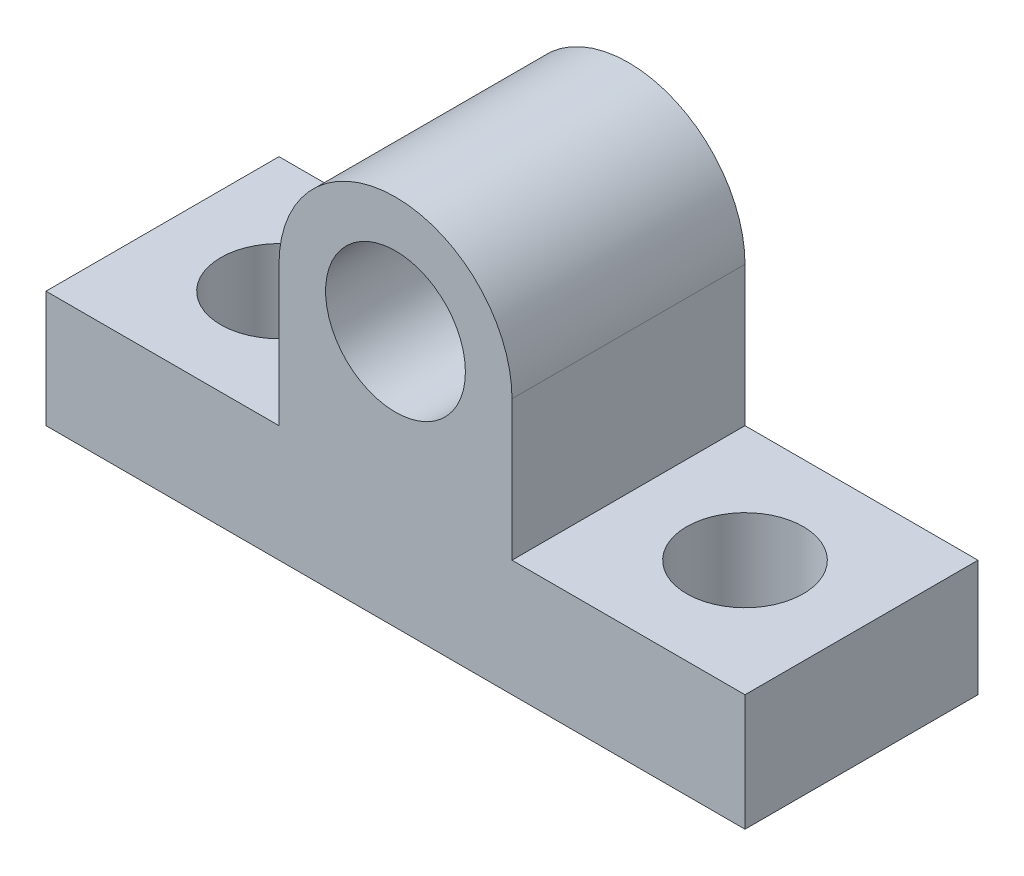
ISO-10303-21;
HEADER;
FILE_DESCRIPTION(('STEP AP214'),'2;1');
FILE_NAME('part.step','',(''),(''),'','','');
FILE_SCHEMA(('AUTOMOTIVE_DESIGN { 1 0 10303 214 1 1 1 1 }'));
ENDSEC;
DATA;
#1=APPLICATION_CONTEXT('core data for automotive mechanical design processes');
#2=APPLICATION_PROTOCOL_DEFINITION('international standard','automotive_design',2000,#1);
#3=PRODUCT_CONTEXT('',#1,'mechanical');
#4=PRODUCT('Part','Part','',(#3));
#5=PRODUCT_RELATED_PRODUCT_CATEGORY('part','',(#4));
#6=PRODUCT_DEFINITION_FORMATION('','',#4);
#7=PRODUCT_DEFINITION_CONTEXT('part definition',#1,'design');
#8=PRODUCT_DEFINITION('design','',#6,#7);
#9=PRODUCT_DEFINITION_SHAPE('','',#8);
#10=(LENGTH_UNIT() NAMED_UNIT(*) SI_UNIT(.MILLI.,.METRE.));
#11=(NAMED_UNIT(*) PLANE_ANGLE_UNIT() SI_UNIT($,.RADIAN.));
#12=(NAMED_UNIT(*) SI_UNIT($,.STERADIAN.) SOLID_ANGLE_UNIT());
#13=UNCERTAINTY_MEASURE_WITH_UNIT(LENGTH_MEASURE(1.E-05),#10,'distance_accuracy_value','');
#14=(GEOMETRIC_REPRESENTATION_CONTEXT(3) GLOBAL_UNCERTAINTY_ASSIGNED_CONTEXT((#13)) GLOBAL_UNIT_ASSIGNED_CONTEXT((#10,
#11,#12)) REPRESENTATION_CONTEXT('',''));
#15=CARTESIAN_POINT('',(0.,0.,0.));
#16=DIRECTION('',(0.,0.,1.));
#17=DIRECTION('',(1.,0.,0.));
#18=AXIS2_PLACEMENT_3D('',#15,#16,#17);
#19=CARTESIAN_POINT('',(0.,6.,10.));
#20=DIRECTION('',(0.,0.,1.));
#21=DIRECTION('',(1.,0.,0.));
#22=AXIS2_PLACEMENT_3D('',#19,#20,#21);
#23=PLANE('',#22);
#24=DIRECTION('',(0.,1.,0.));
#25=VECTOR('',#24,1.);
#26=CARTESIAN_POINT('',(15.,0.,10.));
#27=LINE('',#26,#25);
#28=CARTESIAN_POINT('',(15.,-5.,10.));
#29=VERTEX_POINT('',#28);
#30=CARTESIAN_POINT('',(15.,0.,10.));
#31=VERTEX_POINT('',#30);
#32=EDGE_CURVE('E164',#29,#31,#27,.T.);
#33=ORIENTED_EDGE('',*,*,#32,.T.);
#34=DIRECTION('',(-1.,0.,0.));
#35=VECTOR('',#34,1.);
#36=CARTESIAN_POINT('',(5.,0.,10.));
#37=LINE('',#36,#35);
#38=CARTESIAN_POINT('',(5.,0.,10.));
#39=VERTEX_POINT('',#38);
#40=EDGE_CURVE('E100',#31,#39,#37,.T.);
#41=ORIENTED_EDGE('',*,*,#40,.T.);
#42=DIRECTION('',(0.,1.,0.));
#43=VECTOR('',#42,1.);
#44=CARTESIAN_POINT('',(5.,6.,10.));
#45=LINE('',#44,#43);
#46=CARTESIAN_POINT('',(5.,6.,10.));
#47=VERTEX_POINT('',#46);
#48=EDGE_CURVE('E185',#39,#47,#45,.T.);
#49=ORIENTED_EDGE('',*,*,#48,.T.);
#50=CARTESIAN_POINT('',(0.,6.,10.));
#51=DIRECTION('',(0.,0.,1.));
#52=DIRECTION('',(1.,0.,0.));
#53=AXIS2_PLACEMENT_3D('',#50,#51,#52);
#54=CIRCLE('',#53,5.);
#55=CARTESIAN_POINT('',(-5.,6.,10.));
#56=VERTEX_POINT('',#55);
#57=EDGE_CURVE('E199',#47,#56,#54,.T.);
#58=ORIENTED_EDGE('',*,*,#57,.T.);
#59=DIRECTION('',(0.,-1.,0.));
#60=VECTOR('',#59,1.);
#61=CARTESIAN_POINT('',(-5.,6.,10.));
#62=LINE('',#61,#60);
#63=CARTESIAN_POINT('',(-5.,0.,10.));
#64=VERTEX_POINT('',#63);
#65=EDGE_CURVE('E119',#56,#64,#62,.T.);
#66=ORIENTED_EDGE('',*,*,#65,.T.);
#67=DIRECTION('',(-1.,0.,0.));
#68=VECTOR('',#67,1.);
#69=CARTESIAN_POINT('',(-5.,0.,10.));
#70=LINE('',#69,#68);
#71=CARTESIAN_POINT('',(-15.,0.,10.));
#72=VERTEX_POINT('',#71);
#73=EDGE_CURVE('E113',#64,#72,#70,.T.);
#74=ORIENTED_EDGE('',*,*,#73,.T.);
#75=DIRECTION('',(0.,-1.,0.));
#76=VECTOR('',#75,1.);
#77=CARTESIAN_POINT('',(-15.,0.,10.));
#78=LINE('',#77,#76);
#79=CARTESIAN_POINT('',(-15.,-5.,10.));
#80=VERTEX_POINT('',#79);
#81=EDGE_CURVE('E117',#72,#80,#78,.T.);
#82=ORIENTED_EDGE('',*,*,#81,.T.);
#83=DIRECTION('',(1.,0.,0.));
#84=VECTOR('',#83,1.);
#85=CARTESIAN_POINT('',(15.,-5.,10.));
#86=LINE('',#85,#84);
#87=EDGE_CURVE('E57',#80,#29,#86,.T.);
#88=ORIENTED_EDGE('',*,*,#87,.T.);
#89=EDGE_LOOP('',(#33,#41,#49,#58,#66,#74,#82,#88));
#90=FACE_BOUND('',#89,.T.);
#91=CARTESIAN_POINT('',(0.,6.,10.));
#92=DIRECTION('',(0.,0.,1.));
#93=DIRECTION('',(1.,0.,0.));
#94=AXIS2_PLACEMENT_3D('',#91,#92,#93);
#95=CIRCLE('',#94,3.);
#96=CARTESIAN_POINT('',(3.,6.,10.));
#97=VERTEX_POINT('',#96);
#98=EDGE_CURVE('E146',#97,#97,#95,.T.);
#99=ORIENTED_EDGE('',*,*,#98,.F.);
#100=EDGE_LOOP('',(#99));
#101=FACE_BOUND('',#100,.T.);
#102=ADVANCED_FACE('F39',(#90,#101),#23,.T.);
#103=CARTESIAN_POINT('',(0.,6.,0.));
#104=DIRECTION('',(0.,0.,1.));
#105=DIRECTION('',(1.,0.,0.));
#106=AXIS2_PLACEMENT_3D('',#103,#104,#105);
#107=PLANE('',#106);
#108=DIRECTION('',(0.,1.,0.));
#109=VECTOR('',#108,1.);
#110=CARTESIAN_POINT('',(15.,0.,0.));
#111=LINE('',#110,#109);
#112=CARTESIAN_POINT('',(15.,-5.,0.));
#113=VERTEX_POINT('',#112);
#114=CARTESIAN_POINT('',(15.,0.,0.));
#115=VERTEX_POINT('',#114);
#116=EDGE_CURVE('E141',#113,#115,#111,.T.);
#117=ORIENTED_EDGE('',*,*,#116,.F.);
#118=DIRECTION('',(1.,0.,0.));
#119=VECTOR('',#118,1.);
#120=CARTESIAN_POINT('',(15.,-5.,0.));
#121=LINE('',#120,#119);
#122=CARTESIAN_POINT('',(-15.,-5.,0.));
#123=VERTEX_POINT('',#122);
#124=EDGE_CURVE('E92',#123,#113,#121,.T.);
#125=ORIENTED_EDGE('',*,*,#124,.F.);
#126=DIRECTION('',(0.,-1.,0.));
#127=VECTOR('',#126,1.);
#128=CARTESIAN_POINT('',(-15.,0.,0.));
#129=LINE('',#128,#127);
#130=CARTESIAN_POINT('',(-15.,0.,0.));
#131=VERTEX_POINT('',#130);
#132=EDGE_CURVE('E86',#131,#123,#129,.T.);
#133=ORIENTED_EDGE('',*,*,#132,.F.);
#134=DIRECTION('',(-1.,0.,0.));
#135=VECTOR('',#134,1.);
#136=CARTESIAN_POINT('',(-5.,0.,0.));
#137=LINE('',#136,#135);
#138=CARTESIAN_POINT('',(-5.,0.,0.));
#139=VERTEX_POINT('',#138);
#140=EDGE_CURVE('E128',#139,#131,#137,.T.);
#141=ORIENTED_EDGE('',*,*,#140,.F.);
#142=DIRECTION('',(0.,-1.,0.));
#143=VECTOR('',#142,1.);
#144=CARTESIAN_POINT('',(-5.,6.,0.));
#145=LINE('',#144,#143);
#146=CARTESIAN_POINT('',(-5.,6.,0.));
#147=VERTEX_POINT('',#146);
#148=EDGE_CURVE('E155',#147,#139,#145,.T.);
#149=ORIENTED_EDGE('',*,*,#148,.F.);
#150=CARTESIAN_POINT('',(0.,6.,0.));
#151=DIRECTION('',(0.,0.,1.));
#152=DIRECTION('',(1.,0.,0.));
#153=AXIS2_PLACEMENT_3D('',#150,#151,#152);
#154=CIRCLE('',#153,5.);
#155=CARTESIAN_POINT('',(5.,6.,0.));
#156=VERTEX_POINT('',#155);
#157=EDGE_CURVE('E152',#156,#147,#154,.T.);
#158=ORIENTED_EDGE('',*,*,#157,.F.);
#159=DIRECTION('',(0.,1.,0.));
#160=VECTOR('',#159,1.);
#161=CARTESIAN_POINT('',(5.,6.,0.));
#162=LINE('',#161,#160);
#163=CARTESIAN_POINT('',(5.,0.,0.));
#164=VERTEX_POINT('',#163);
#165=EDGE_CURVE('E149',#164,#156,#162,.T.);
#166=ORIENTED_EDGE('',*,*,#165,.F.);
#167=DIRECTION('',(-1.,0.,0.));
#168=VECTOR('',#167,1.);
#169=CARTESIAN_POINT('',(5.,0.,0.));
#170=LINE('',#169,#168);
#171=EDGE_CURVE('E145',#115,#164,#170,.T.);
#172=ORIENTED_EDGE('',*,*,#171,.F.);
#173=EDGE_LOOP('',(#117,#125,#133,#141,#149,#158,#166,#172));
#174=FACE_BOUND('',#173,.T.);
#175=CARTESIAN_POINT('',(0.,6.,0.));
#176=DIRECTION('',(0.,0.,1.));
#177=DIRECTION('',(1.,0.,0.));
#178=AXIS2_PLACEMENT_3D('',#175,#176,#177);
#179=CIRCLE('',#178,3.);
#180=CARTESIAN_POINT('',(3.,6.,0.));
#181=VERTEX_POINT('',#180);
#182=EDGE_CURVE('E209',#181,#181,#179,.T.);
#183=ORIENTED_EDGE('',*,*,#182,.T.);
#184=EDGE_LOOP('',(#183));
#185=FACE_BOUND('',#184,.T.);
#186=ADVANCED_FACE('F189',(#174,#185),#107,.F.);
#187=CARTESIAN_POINT('',(15.,0.,10.));
#188=DIRECTION('',(-1.,0.,0.));
#189=DIRECTION('',(0.,0.,1.));
#190=AXIS2_PLACEMENT_3D('',#187,#188,#189);
#191=PLANE('',#190);
#192=ORIENTED_EDGE('',*,*,#116,.T.);
#193=DIRECTION('',(0.,0.,-1.));
#194=VECTOR('',#193,1.);
#195=CARTESIAN_POINT('',(15.,0.,10.));
#196=LINE('',#195,#194);
#197=EDGE_CURVE('E11',#31,#115,#196,.T.);
#198=ORIENTED_EDGE('',*,*,#197,.F.);
#199=ORIENTED_EDGE('',*,*,#32,.F.);
#200=DIRECTION('',(0.,0.,-1.));
#201=VECTOR('',#200,1.);
#202=CARTESIAN_POINT('',(15.,-5.,10.));
#203=LINE('',#202,#201);
#204=EDGE_CURVE('E137',#29,#113,#203,.T.);
#205=ORIENTED_EDGE('',*,*,#204,.T.);
#206=EDGE_LOOP('',(#192,#198,#199,#205));
#207=FACE_BOUND('',#206,.T.);
#208=ADVANCED_FACE('F41',(#207),#191,.F.);
#209=CARTESIAN_POINT('',(5.,0.,10.));
#210=DIRECTION('',(0.,-1.,0.));
#211=DIRECTION('',(1.,0.,0.));
#212=AXIS2_PLACEMENT_3D('',#209,#210,#211);
#213=PLANE('',#212);
#214=CARTESIAN_POINT('',(10.,0.,5.));
#215=DIRECTION('',(0.,1.,0.));
#216=DIRECTION('',(-1.,0.,0.));
#217=AXIS2_PLACEMENT_3D('',#214,#215,#216);
#218=CIRCLE('',#217,2.5);
#219=CARTESIAN_POINT('',(7.5,0.,5.));
#220=VERTEX_POINT('',#219);
#221=EDGE_CURVE('E225',#220,#220,#218,.T.);
#222=ORIENTED_EDGE('',*,*,#221,.F.);
#223=EDGE_LOOP('',(#222));
#224=FACE_BOUND('',#223,.T.);
#225=ORIENTED_EDGE('',*,*,#171,.T.);
#226=DIRECTION('',(0.,0.,-1.));
#227=VECTOR('',#226,1.);
#228=CARTESIAN_POINT('',(5.,0.,10.));
#229=LINE('',#228,#227);
#230=EDGE_CURVE('E49',#39,#164,#229,.T.);
#231=ORIENTED_EDGE('',*,*,#230,.F.);
#232=ORIENTED_EDGE('',*,*,#40,.F.);
#233=ORIENTED_EDGE('',*,*,#197,.T.);
#234=EDGE_LOOP('',(#225,#231,#232,#233));
#235=FACE_BOUND('',#234,.T.);
#236=ADVANCED_FACE('F243',(#224,#235),#213,.F.);
#237=CARTESIAN_POINT('',(5.,6.,10.));
#238=DIRECTION('',(-1.,0.,0.));
#239=DIRECTION('',(0.,-1.,0.));
#240=AXIS2_PLACEMENT_3D('',#237,#238,#239);
#241=PLANE('',#240);
#242=ORIENTED_EDGE('',*,*,#165,.T.);
#243=DIRECTION('',(0.,0.,-1.));
#244=VECTOR('',#243,1.);
#245=CARTESIAN_POINT('',(5.,6.,10.));
#246=LINE('',#245,#244);
#247=EDGE_CURVE('E175',#47,#156,#246,.T.);
#248=ORIENTED_EDGE('',*,*,#247,.F.);
#249=ORIENTED_EDGE('',*,*,#48,.F.);
#250=ORIENTED_EDGE('',*,*,#230,.T.);
#251=EDGE_LOOP('',(#242,#248,#249,#250));
#252=FACE_BOUND('',#251,.T.);
#253=ADVANCED_FACE('F183',(#252),#241,.F.);
#254=CARTESIAN_POINT('',(0.,6.,10.));
#255=DIRECTION('',(0.,0.,-1.));
#256=DIRECTION('',(-1.,0.,0.));
#257=AXIS2_PLACEMENT_3D('',#254,#255,#256);
#258=CYLINDRICAL_SURFACE('',#257,5.);
#259=ORIENTED_EDGE('',*,*,#157,.T.);
#260=DIRECTION('',(0.,0.,-1.));
#261=VECTOR('',#260,1.);
#262=CARTESIAN_POINT('',(-5.,6.,10.));
#263=LINE('',#262,#261);
#264=EDGE_CURVE('E171',#56,#147,#263,.T.);
#265=ORIENTED_EDGE('',*,*,#264,.F.);
#266=ORIENTED_EDGE('',*,*,#57,.F.);
#267=ORIENTED_EDGE('',*,*,#247,.T.);
#268=EDGE_LOOP('',(#259,#265,#266,#267));
#269=FACE_BOUND('',#268,.T.);
#270=ADVANCED_FACE('F194',(#269),#258,.T.);
#271=CARTESIAN_POINT('',(-5.,6.,10.));
#272=DIRECTION('',(1.,0.,0.));
#273=DIRECTION('',(0.,1.,0.));
#274=AXIS2_PLACEMENT_3D('',#271,#272,#273);
#275=PLANE('',#274);
#276=ORIENTED_EDGE('',*,*,#148,.T.);
#277=DIRECTION('',(0.,0.,-1.));
#278=VECTOR('',#277,1.);
#279=CARTESIAN_POINT('',(-5.,0.,10.));
#280=LINE('',#279,#278);
#281=EDGE_CURVE('E130',#64,#139,#280,.T.);
#282=ORIENTED_EDGE('',*,*,#281,.F.);
#283=ORIENTED_EDGE('',*,*,#65,.F.);
#284=ORIENTED_EDGE('',*,*,#264,.T.);
#285=EDGE_LOOP('',(#276,#282,#283,#284));
#286=FACE_BOUND('',#285,.T.);
#287=ADVANCED_FACE('F197',(#286),#275,.F.);
#288=CARTESIAN_POINT('',(-5.,0.,10.));
#289=DIRECTION('',(0.,-1.,0.));
#290=DIRECTION('',(1.,0.,0.));
#291=AXIS2_PLACEMENT_3D('',#288,#289,#290);
#292=PLANE('',#291);
#293=CARTESIAN_POINT('',(-10.,0.,5.));
#294=DIRECTION('',(0.,1.,0.));
#295=DIRECTION('',(-1.,0.,0.));
#296=AXIS2_PLACEMENT_3D('',#293,#294,#295);
#297=CIRCLE('',#296,2.5);
#298=CARTESIAN_POINT('',(-12.5,0.,5.));
#299=VERTEX_POINT('',#298);
#300=EDGE_CURVE('E217',#299,#299,#297,.T.);
#301=ORIENTED_EDGE('',*,*,#300,.F.);
#302=EDGE_LOOP('',(#301));
#303=FACE_BOUND('',#302,.T.);
#304=ORIENTED_EDGE('',*,*,#140,.T.);
#305=DIRECTION('',(0.,0.,-1.));
#306=VECTOR('',#305,1.);
#307=CARTESIAN_POINT('',(-15.,0.,10.));
#308=LINE('',#307,#306);
#309=EDGE_CURVE('E125',#72,#131,#308,.T.);
#310=ORIENTED_EDGE('',*,*,#309,.F.);
#311=ORIENTED_EDGE('',*,*,#73,.F.);
#312=ORIENTED_EDGE('',*,*,#281,.T.);
#313=EDGE_LOOP('',(#304,#310,#311,#312));
#314=FACE_BOUND('',#313,.T.);
#315=ADVANCED_FACE('F126',(#303,#314),#292,.F.);
#316=CARTESIAN_POINT('',(-15.,0.,10.));
#317=DIRECTION('',(1.,0.,0.));
#318=DIRECTION('',(0.,0.,-1.));
#319=AXIS2_PLACEMENT_3D('',#316,#317,#318);
#320=PLANE('',#319);
#321=ORIENTED_EDGE('',*,*,#132,.T.);
#322=DIRECTION('',(0.,0.,-1.));
#323=VECTOR('',#322,1.);
#324=CARTESIAN_POINT('',(-15.,-5.,10.));
#325=LINE('',#324,#323);
#326=EDGE_CURVE('E131',#80,#123,#325,.T.);
#327=ORIENTED_EDGE('',*,*,#326,.F.);
#328=ORIENTED_EDGE('',*,*,#81,.F.);
#329=ORIENTED_EDGE('',*,*,#309,.T.);
#330=EDGE_LOOP('',(#321,#327,#328,#329));
#331=FACE_BOUND('',#330,.T.);
#332=ADVANCED_FACE('F133',(#331),#320,.F.);
#333=CARTESIAN_POINT('',(15.,-5.,10.));
#334=DIRECTION('',(0.,1.,0.));
#335=DIRECTION('',(0.,0.,1.));
#336=AXIS2_PLACEMENT_3D('',#333,#334,#335);
#337=PLANE('',#336);
#338=CARTESIAN_POINT('',(10.,-5.,5.));
#339=DIRECTION('',(0.,1.,0.));
#340=DIRECTION('',(-1.,0.,0.));
#341=AXIS2_PLACEMENT_3D('',#338,#339,#340);
#342=CIRCLE('',#341,2.5);
#343=CARTESIAN_POINT('',(7.5,-5.,5.));
#344=VERTEX_POINT('',#343);
#345=EDGE_CURVE('E221',#344,#344,#342,.T.);
#346=ORIENTED_EDGE('',*,*,#345,.T.);
#347=EDGE_LOOP('',(#346));
#348=FACE_BOUND('',#347,.T.);
#349=CARTESIAN_POINT('',(-10.,-5.,5.));
#350=DIRECTION('',(0.,1.,0.));
#351=DIRECTION('',(-1.,0.,0.));
#352=AXIS2_PLACEMENT_3D('',#349,#350,#351);
#353=CIRCLE('',#352,2.5);
#354=CARTESIAN_POINT('',(-12.5,-5.,5.));
#355=VERTEX_POINT('',#354);
#356=EDGE_CURVE('E213',#355,#355,#353,.T.);
#357=ORIENTED_EDGE('',*,*,#356,.T.);
#358=EDGE_LOOP('',(#357));
#359=FACE_BOUND('',#358,.T.);
#360=ORIENTED_EDGE('',*,*,#124,.T.);
#361=ORIENTED_EDGE('',*,*,#204,.F.);
#362=ORIENTED_EDGE('',*,*,#87,.F.);
#363=ORIENTED_EDGE('',*,*,#326,.T.);
#364=EDGE_LOOP('',(#360,#361,#362,#363));
#365=FACE_BOUND('',#364,.T.);
#366=ADVANCED_FACE('F233',(#348,#359,#365),#337,.F.);
#367=CARTESIAN_POINT('',(0.,6.,10.));
#368=DIRECTION('',(0.,0.,-1.));
#369=DIRECTION('',(-1.,0.,0.));
#370=AXIS2_PLACEMENT_3D('',#367,#368,#369);
#371=CYLINDRICAL_SURFACE('',#370,3.);
#372=ORIENTED_EDGE('',*,*,#98,.T.);
#373=EDGE_LOOP('',(#372));
#374=FACE_BOUND('',#373,.T.);
#375=ORIENTED_EDGE('',*,*,#182,.F.);
#376=EDGE_LOOP('',(#375));
#377=FACE_BOUND('',#376,.T.);
#378=ADVANCED_FACE('F249',(#374,#377),#371,.F.);
#379=CARTESIAN_POINT('',(-10.,-5.,5.));
#380=DIRECTION('',(0.,1.,0.));
#381=DIRECTION('',(-1.,0.,0.));
#382=AXIS2_PLACEMENT_3D('',#379,#380,#381);
#383=CYLINDRICAL_SURFACE('',#382,2.5);
#384=ORIENTED_EDGE('',*,*,#356,.F.);
#385=EDGE_LOOP('',(#384));
#386=FACE_BOUND('',#385,.T.);
#387=ORIENTED_EDGE('',*,*,#300,.T.);
#388=EDGE_LOOP('',(#387));
#389=FACE_BOUND('',#388,.T.);
#390=ADVANCED_FACE('F239',(#386,#389),#383,.F.);
#391=CARTESIAN_POINT('',(10.,-5.,5.));
#392=DIRECTION('',(0.,1.,0.));
#393=DIRECTION('',(-1.,0.,0.));
#394=AXIS2_PLACEMENT_3D('',#391,#392,#393);
#395=CYLINDRICAL_SURFACE('',#394,2.5);
#396=ORIENTED_EDGE('',*,*,#345,.F.);
#397=EDGE_LOOP('',(#396));
#398=FACE_BOUND('',#397,.T.);
#399=ORIENTED_EDGE('',*,*,#221,.T.);
#400=EDGE_LOOP('',(#399));
#401=FACE_BOUND('',#400,.T.);
#402=ADVANCED_FACE('F236',(#398,#401),#395,.F.);
#403=CLOSED_SHELL('',(#102,#186,#208,#236,#253,#270,#287,#315,#332,#366,#378,#390,#402));
#404=MANIFOLD_SOLID_BREP('B2',#403);
#405=ADVANCED_BREP_SHAPE_REPRESENTATION('',(#18,#404),#14);
#406=SHAPE_DEFINITION_REPRESENTATION(#9,#405);
ENDSEC;
END-ISO-10303-21;
